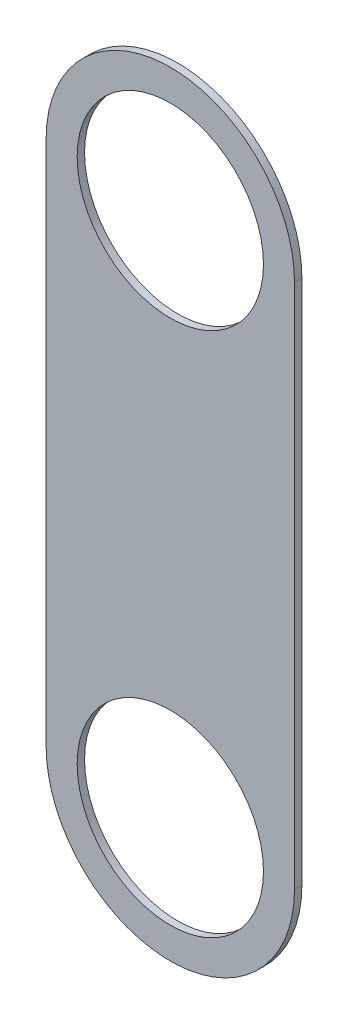
ISO-10303-21;
HEADER;
FILE_DESCRIPTION(('STEP AP214'),'2;1');
FILE_NAME('part.step','',(''),(''),'','','');
FILE_SCHEMA(('AUTOMOTIVE_DESIGN { 1 0 10303 214 1 1 1 1 }'));
ENDSEC;
DATA;
#1=APPLICATION_CONTEXT('core data for automotive mechanical design processes');
#2=APPLICATION_PROTOCOL_DEFINITION('international standard','automotive_design',2000,#1);
#3=PRODUCT_CONTEXT('',#1,'mechanical');
#4=PRODUCT('Part','Part','',(#3));
#5=PRODUCT_RELATED_PRODUCT_CATEGORY('part','',(#4));
#6=PRODUCT_DEFINITION_FORMATION('','',#4);
#7=PRODUCT_DEFINITION_CONTEXT('part definition',#1,'design');
#8=PRODUCT_DEFINITION('design','',#6,#7);
#9=PRODUCT_DEFINITION_SHAPE('','',#8);
#10=(LENGTH_UNIT() NAMED_UNIT(*) SI_UNIT(.MILLI.,.METRE.));
#11=(NAMED_UNIT(*) PLANE_ANGLE_UNIT() SI_UNIT($,.RADIAN.));
#12=(NAMED_UNIT(*) SI_UNIT($,.STERADIAN.) SOLID_ANGLE_UNIT());
#13=UNCERTAINTY_MEASURE_WITH_UNIT(LENGTH_MEASURE(1.E-05),#10,'distance_accuracy_value','');
#14=(GEOMETRIC_REPRESENTATION_CONTEXT(3) GLOBAL_UNCERTAINTY_ASSIGNED_CONTEXT((#13)) GLOBAL_UNIT_ASSIGNED_CONTEXT((#10,
#11,#12)) REPRESENTATION_CONTEXT('',''));
#15=CARTESIAN_POINT('',(0.,0.,0.));
#16=DIRECTION('',(0.,0.,1.));
#17=DIRECTION('',(1.,0.,0.));
#18=AXIS2_PLACEMENT_3D('',#15,#16,#17);
#19=CARTESIAN_POINT('',(106.9999892,43.4600096,0.));
#20=DIRECTION('',(-1.,0.,0.));
#21=DIRECTION('',(0.,1.,0.));
#22=AXIS2_PLACEMENT_3D('',#19,#20,#21);
#23=PLANE('',#22);
#24=DIRECTION('',(0.,1.,0.));
#25=VECTOR('',#24,1.);
#26=CARTESIAN_POINT('',(106.9999892,43.4600096,0.03556));
#27=LINE('',#26,#25);
#28=CARTESIAN_POINT('',(106.9999892,43.4600096,0.03556));
#29=VERTEX_POINT('',#28);
#30=CARTESIAN_POINT('',(106.9999892,46.0000096,0.03556));
#31=VERTEX_POINT('',#30);
#32=EDGE_CURVE('E11',#29,#31,#27,.T.);
#33=ORIENTED_EDGE('',*,*,#32,.F.);
#34=DIRECTION('',(0.,0.,1.));
#35=VECTOR('',#34,1.);
#36=CARTESIAN_POINT('',(106.9999892,43.4600096,0.));
#37=LINE('',#36,#35);
#38=CARTESIAN_POINT('',(106.9999892,43.4600096,0.));
#39=VERTEX_POINT('',#38);
#40=EDGE_CURVE('E24',#39,#29,#37,.T.);
#41=ORIENTED_EDGE('',*,*,#40,.F.);
#42=DIRECTION('',(0.,1.,0.));
#43=VECTOR('',#42,1.);
#44=CARTESIAN_POINT('',(106.9999892,43.4600096,0.));
#45=LINE('',#44,#43);
#46=CARTESIAN_POINT('',(106.9999892,46.0000096,0.));
#47=VERTEX_POINT('',#46);
#48=EDGE_CURVE('E110',#39,#47,#45,.T.);
#49=ORIENTED_EDGE('',*,*,#48,.T.);
#50=DIRECTION('',(0.,0.,1.));
#51=VECTOR('',#50,1.);
#52=CARTESIAN_POINT('',(106.9999892,46.0000096,0.));
#53=LINE('',#52,#51);
#54=EDGE_CURVE('E37',#47,#31,#53,.T.);
#55=ORIENTED_EDGE('',*,*,#54,.T.);
#56=EDGE_LOOP('',(#33,#41,#49,#55));
#57=FACE_BOUND('',#56,.T.);
#58=ADVANCED_FACE('F17',(#57),#23,.F.);
#59=CARTESIAN_POINT('',(106.3999904,43.4600096,0.));
#60=DIRECTION('',(0.,0.,-1.));
#61=DIRECTION('',(-1.,0.,0.));
#62=AXIS2_PLACEMENT_3D('',#59,#60,#61);
#63=CYLINDRICAL_SURFACE('',#62,0.599998800000004);
#64=CARTESIAN_POINT('',(106.3999904,43.4600096,0.03556));
#65=DIRECTION('',(0.,0.,1.));
#66=DIRECTION('',(-1.,0.,0.));
#67=AXIS2_PLACEMENT_3D('',#64,#65,#66);
#68=CIRCLE('',#67,0.599998800000004);
#69=CARTESIAN_POINT('',(105.7999916,43.4600096,0.03556));
#70=VERTEX_POINT('',#69);
#71=EDGE_CURVE('E106',#70,#29,#68,.T.);
#72=ORIENTED_EDGE('',*,*,#71,.F.);
#73=DIRECTION('',(0.,0.,1.));
#74=VECTOR('',#73,1.);
#75=CARTESIAN_POINT('',(105.7999916,43.4600096,0.));
#76=LINE('',#75,#74);
#77=CARTESIAN_POINT('',(105.7999916,43.4600096,0.));
#78=VERTEX_POINT('',#77);
#79=EDGE_CURVE('E104',#78,#70,#76,.T.);
#80=ORIENTED_EDGE('',*,*,#79,.F.);
#81=CARTESIAN_POINT('',(106.3999904,43.4600096,0.));
#82=DIRECTION('',(0.,0.,1.));
#83=DIRECTION('',(-1.,0.,0.));
#84=AXIS2_PLACEMENT_3D('',#81,#82,#83);
#85=CIRCLE('',#84,0.599998800000004);
#86=EDGE_CURVE('E102',#78,#39,#85,.T.);
#87=ORIENTED_EDGE('',*,*,#86,.T.);
#88=ORIENTED_EDGE('',*,*,#40,.T.);
#89=EDGE_LOOP('',(#72,#80,#87,#88));
#90=FACE_BOUND('',#89,.T.);
#91=ADVANCED_FACE('F126',(#90),#63,.T.);
#92=CARTESIAN_POINT('',(106.3999904,46.0000096,0.));
#93=DIRECTION('',(0.,0.,-1.));
#94=DIRECTION('',(1.,0.,0.));
#95=AXIS2_PLACEMENT_3D('',#92,#93,#94);
#96=CYLINDRICAL_SURFACE('',#95,0.599998800000002);
#97=CARTESIAN_POINT('',(106.3999904,46.0000096,0.03556));
#98=DIRECTION('',(0.,0.,1.));
#99=DIRECTION('',(1.,0.,0.));
#100=AXIS2_PLACEMENT_3D('',#97,#98,#99);
#101=CIRCLE('',#100,0.599998800000002);
#102=CARTESIAN_POINT('',(105.7999916,46.0000096,0.03556));
#103=VERTEX_POINT('',#102);
#104=EDGE_CURVE('E99',#31,#103,#101,.T.);
#105=ORIENTED_EDGE('',*,*,#104,.F.);
#106=ORIENTED_EDGE('',*,*,#54,.F.);
#107=CARTESIAN_POINT('',(106.3999904,46.0000096,0.));
#108=DIRECTION('',(0.,0.,1.));
#109=DIRECTION('',(1.,0.,0.));
#110=AXIS2_PLACEMENT_3D('',#107,#108,#109);
#111=CIRCLE('',#110,0.599998800000002);
#112=CARTESIAN_POINT('',(105.7999916,46.0000096,0.));
#113=VERTEX_POINT('',#112);
#114=EDGE_CURVE('E96',#47,#113,#111,.T.);
#115=ORIENTED_EDGE('',*,*,#114,.T.);
#116=DIRECTION('',(0.,0.,1.));
#117=VECTOR('',#116,1.);
#118=CARTESIAN_POINT('',(105.7999916,46.0000096,0.));
#119=LINE('',#118,#117);
#120=EDGE_CURVE('E94',#113,#103,#119,.T.);
#121=ORIENTED_EDGE('',*,*,#120,.T.);
#122=EDGE_LOOP('',(#105,#106,#115,#121));
#123=FACE_BOUND('',#122,.T.);
#124=ADVANCED_FACE('F119',(#123),#96,.T.);
#125=CARTESIAN_POINT('',(105.7999916,46.0000096,0.));
#126=DIRECTION('',(1.,0.,0.));
#127=DIRECTION('',(0.,-1.,0.));
#128=AXIS2_PLACEMENT_3D('',#125,#126,#127);
#129=PLANE('',#128);
#130=DIRECTION('',(0.,-1.,0.));
#131=VECTOR('',#130,1.);
#132=CARTESIAN_POINT('',(105.7999916,46.0000096,0.03556));
#133=LINE('',#132,#131);
#134=EDGE_CURVE('E91',#103,#70,#133,.T.);
#135=ORIENTED_EDGE('',*,*,#134,.F.);
#136=ORIENTED_EDGE('',*,*,#120,.F.);
#137=DIRECTION('',(0.,-1.,0.));
#138=VECTOR('',#137,1.);
#139=CARTESIAN_POINT('',(105.7999916,46.0000096,0.));
#140=LINE('',#139,#138);
#141=EDGE_CURVE('E88',#113,#78,#140,.T.);
#142=ORIENTED_EDGE('',*,*,#141,.T.);
#143=ORIENTED_EDGE('',*,*,#79,.T.);
#144=EDGE_LOOP('',(#135,#136,#142,#143));
#145=FACE_BOUND('',#144,.T.);
#146=ADVANCED_FACE('F125',(#145),#129,.F.);
#147=CARTESIAN_POINT('',(106.3999904,43.4600096,0.));
#148=DIRECTION('',(0.,0.,-1.));
#149=DIRECTION('',(1.,0.,0.));
#150=AXIS2_PLACEMENT_3D('',#147,#148,#149);
#151=CYLINDRICAL_SURFACE('',#150,0.4499991);
#152=DIRECTION('',(0.,0.,1.));
#153=VECTOR('',#152,1.);
#154=CARTESIAN_POINT('',(106.8499895,43.4600096,0.));
#155=LINE('',#154,#153);
#156=CARTESIAN_POINT('',(106.8499895,43.4600096,0.));
#157=VERTEX_POINT('',#156);
#158=CARTESIAN_POINT('',(106.8499895,43.4600096,0.03556));
#159=VERTEX_POINT('',#158);
#160=EDGE_CURVE('E86',#157,#159,#155,.T.);
#161=ORIENTED_EDGE('',*,*,#160,.T.);
#162=CARTESIAN_POINT('',(106.3999904,43.4600096,0.03556));
#163=DIRECTION('',(0.,0.,1.));
#164=DIRECTION('',(1.,0.,0.));
#165=AXIS2_PLACEMENT_3D('',#162,#163,#164);
#166=CIRCLE('',#165,0.4499991);
#167=EDGE_CURVE('E83',#159,#159,#166,.T.);
#168=ORIENTED_EDGE('',*,*,#167,.T.);
#169=ORIENTED_EDGE('',*,*,#160,.F.);
#170=CARTESIAN_POINT('',(106.3999904,43.4600096,0.));
#171=DIRECTION('',(0.,0.,1.));
#172=DIRECTION('',(1.,0.,0.));
#173=AXIS2_PLACEMENT_3D('',#170,#171,#172);
#174=CIRCLE('',#173,0.4499991);
#175=EDGE_CURVE('E74',#157,#157,#174,.T.);
#176=ORIENTED_EDGE('',*,*,#175,.F.);
#177=EDGE_LOOP('',(#161,#168,#169,#176));
#178=FACE_BOUND('',#177,.T.);
#179=ADVANCED_FACE('F137',(#178),#151,.F.);
#180=CARTESIAN_POINT('',(106.3999904,46.0000096,0.));
#181=DIRECTION('',(0.,0.,-1.));
#182=DIRECTION('',(1.,0.,0.));
#183=AXIS2_PLACEMENT_3D('',#180,#181,#182);
#184=CYLINDRICAL_SURFACE('',#183,0.4499991);
#185=DIRECTION('',(0.,0.,1.));
#186=VECTOR('',#185,1.);
#187=CARTESIAN_POINT('',(106.8499895,46.0000096,0.));
#188=LINE('',#187,#186);
#189=CARTESIAN_POINT('',(106.8499895,46.0000096,0.));
#190=VERTEX_POINT('',#189);
#191=CARTESIAN_POINT('',(106.8499895,46.0000096,0.03556));
#192=VERTEX_POINT('',#191);
#193=EDGE_CURVE('E68',#190,#192,#188,.T.);
#194=ORIENTED_EDGE('',*,*,#193,.T.);
#195=CARTESIAN_POINT('',(106.3999904,46.0000096,0.03556));
#196=DIRECTION('',(0.,0.,1.));
#197=DIRECTION('',(1.,0.,0.));
#198=AXIS2_PLACEMENT_3D('',#195,#196,#197);
#199=CIRCLE('',#198,0.4499991);
#200=EDGE_CURVE('E73',#192,#192,#199,.T.);
#201=ORIENTED_EDGE('',*,*,#200,.T.);
#202=ORIENTED_EDGE('',*,*,#193,.F.);
#203=CARTESIAN_POINT('',(106.3999904,46.0000096,0.));
#204=DIRECTION('',(0.,0.,1.));
#205=DIRECTION('',(1.,0.,0.));
#206=AXIS2_PLACEMENT_3D('',#203,#204,#205);
#207=CIRCLE('',#206,0.4499991);
#208=EDGE_CURVE('E71',#190,#190,#207,.T.);
#209=ORIENTED_EDGE('',*,*,#208,.F.);
#210=EDGE_LOOP('',(#194,#201,#202,#209));
#211=FACE_BOUND('',#210,.T.);
#212=ADVANCED_FACE('F70',(#211),#184,.F.);
#213=CARTESIAN_POINT('',(106.9999892,43.4600096,0.));
#214=DIRECTION('',(0.,0.,-1.));
#215=DIRECTION('',(-1.,0.,0.));
#216=AXIS2_PLACEMENT_3D('',#213,#214,#215);
#217=PLANE('',#216);
#218=ORIENTED_EDGE('',*,*,#48,.F.);
#219=ORIENTED_EDGE('',*,*,#86,.F.);
#220=ORIENTED_EDGE('',*,*,#141,.F.);
#221=ORIENTED_EDGE('',*,*,#114,.F.);
#222=EDGE_LOOP('',(#218,#219,#220,#221));
#223=FACE_BOUND('',#222,.T.);
#224=ORIENTED_EDGE('',*,*,#175,.T.);
#225=EDGE_LOOP('',(#224));
#226=FACE_BOUND('',#225,.T.);
#227=ORIENTED_EDGE('',*,*,#208,.T.);
#228=EDGE_LOOP('',(#227));
#229=FACE_BOUND('',#228,.T.);
#230=ADVANCED_FACE('F77',(#223,#226,#229),#217,.T.);
#231=CARTESIAN_POINT('',(106.9999892,43.4600096,0.03556));
#232=DIRECTION('',(0.,0.,-1.));
#233=DIRECTION('',(-1.,0.,0.));
#234=AXIS2_PLACEMENT_3D('',#231,#232,#233);
#235=PLANE('',#234);
#236=ORIENTED_EDGE('',*,*,#134,.T.);
#237=ORIENTED_EDGE('',*,*,#71,.T.);
#238=ORIENTED_EDGE('',*,*,#32,.T.);
#239=ORIENTED_EDGE('',*,*,#104,.T.);
#240=EDGE_LOOP('',(#236,#237,#238,#239));
#241=FACE_BOUND('',#240,.T.);
#242=ORIENTED_EDGE('',*,*,#167,.F.);
#243=EDGE_LOOP('',(#242));
#244=FACE_BOUND('',#243,.T.);
#245=ORIENTED_EDGE('',*,*,#200,.F.);
#246=EDGE_LOOP('',(#245));
#247=FACE_BOUND('',#246,.T.);
#248=ADVANCED_FACE('F122',(#241,#244,#247),#235,.F.);
#249=CLOSED_SHELL('',(#58,#91,#124,#146,#179,#212,#230,#248));
#250=MANIFOLD_SOLID_BREP('B1',#249);
#251=ADVANCED_BREP_SHAPE_REPRESENTATION('',(#18,#250),#14);
#252=SHAPE_DEFINITION_REPRESENTATION(#9,#251);
ENDSEC;
END-ISO-10303-21;
